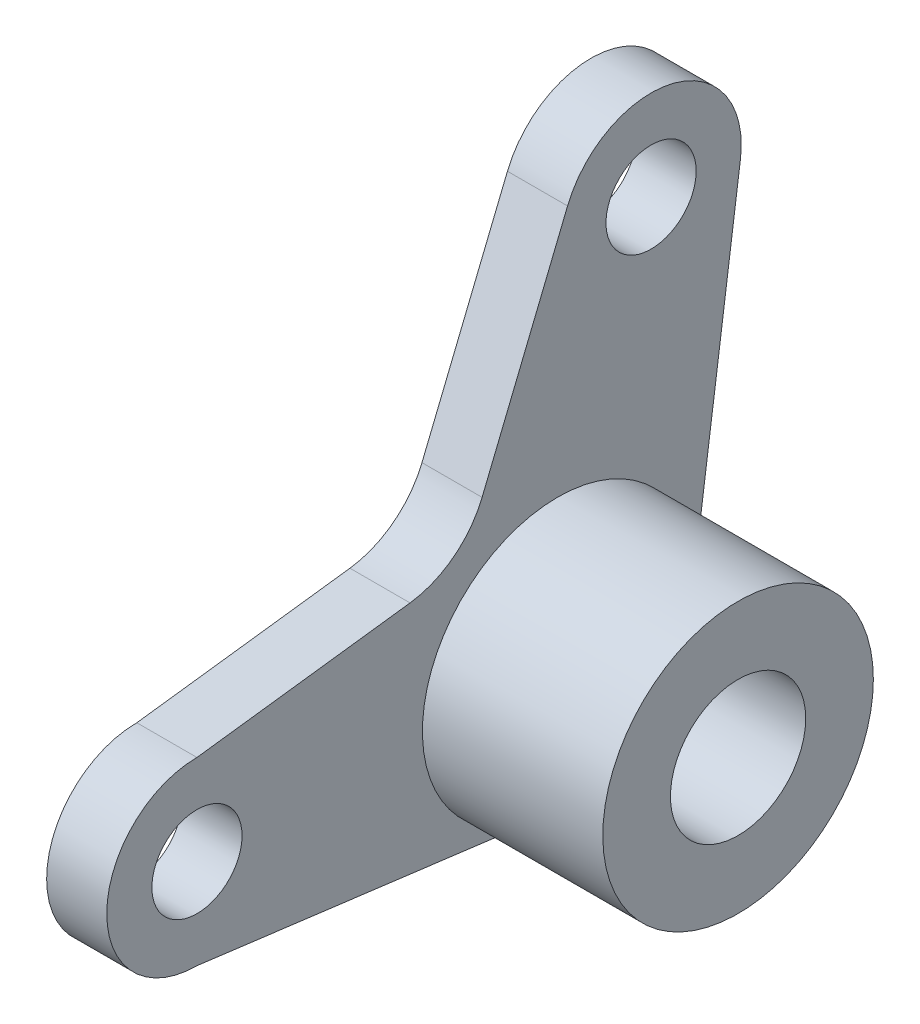
ISO-10303-21;
HEADER;
FILE_DESCRIPTION(('STEP AP214'),'2;1');
FILE_NAME('part.step','',(''),(''),'','','');
FILE_SCHEMA(('AUTOMOTIVE_DESIGN { 1 0 10303 214 1 1 1 1 }'));
ENDSEC;
DATA;
#1=APPLICATION_CONTEXT('core data for automotive mechanical design processes');
#2=APPLICATION_PROTOCOL_DEFINITION('international standard','automotive_design',2000,#1);
#3=PRODUCT_CONTEXT('',#1,'mechanical');
#4=PRODUCT('Part','Part','',(#3));
#5=PRODUCT_RELATED_PRODUCT_CATEGORY('part','',(#4));
#6=PRODUCT_DEFINITION_FORMATION('','',#4);
#7=PRODUCT_DEFINITION_CONTEXT('part definition',#1,'design');
#8=PRODUCT_DEFINITION('design','',#6,#7);
#9=PRODUCT_DEFINITION_SHAPE('','',#8);
#10=(LENGTH_UNIT() NAMED_UNIT(*) SI_UNIT(.MILLI.,.METRE.));
#11=(NAMED_UNIT(*) PLANE_ANGLE_UNIT() SI_UNIT($,.RADIAN.));
#12=(NAMED_UNIT(*) SI_UNIT($,.STERADIAN.) SOLID_ANGLE_UNIT());
#13=UNCERTAINTY_MEASURE_WITH_UNIT(LENGTH_MEASURE(1.E-05),#10,'distance_accuracy_value','');
#14=(GEOMETRIC_REPRESENTATION_CONTEXT(3) GLOBAL_UNCERTAINTY_ASSIGNED_CONTEXT((#13)) GLOBAL_UNIT_ASSIGNED_CONTEXT((#10,
#11,#12)) REPRESENTATION_CONTEXT('',''));
#15=CARTESIAN_POINT('',(0.,0.,0.));
#16=DIRECTION('',(0.,0.,1.));
#17=DIRECTION('',(1.,0.,0.));
#18=AXIS2_PLACEMENT_3D('',#15,#16,#17);
#19=CARTESIAN_POINT('',(20.,16.9888404938314,41.6698847931592));
#20=DIRECTION('',(0.,-0.377529788751808,-0.925997439847981));
#21=DIRECTION('',(0.,0.925997439847981,-0.377529788751808));
#22=AXIS2_PLACEMENT_3D('',#19,#20,#21);
#23=PLANE('',#22);
#24=DIRECTION('',(0.,-0.925997439847981,0.377529788751808));
#25=VECTOR('',#24,1.);
#26=CARTESIAN_POINT('',(0.,16.9888404938314,41.6698847931592));
#27=LINE('',#26,#25);
#28=CARTESIAN_POINT('',(0.,127.236992817243,-3.27836221686229));
#29=VERTEX_POINT('',#28);
#30=CARTESIAN_POINT('',(0.,57.5082556370413,25.1500915614693));
#31=VERTEX_POINT('',#30);
#32=EDGE_CURVE('E150',#29,#31,#27,.T.);
#33=ORIENTED_EDGE('',*,*,#32,.T.);
#34=DIRECTION('',(-1.,0.,0.));
#35=VECTOR('',#34,1.);
#36=CARTESIAN_POINT('',(20.,57.5082556370413,25.1500915614693));
#37=LINE('',#36,#35);
#38=CARTESIAN_POINT('',(20.,57.5082556370413,25.1500915614693));
#39=VERTEX_POINT('',#38);
#40=EDGE_CURVE('E11',#39,#31,#37,.T.);
#41=ORIENTED_EDGE('',*,*,#40,.F.);
#42=DIRECTION('',(0.,-0.925997439847981,0.377529788751808));
#43=VECTOR('',#42,1.);
#44=CARTESIAN_POINT('',(20.,16.9888404938314,41.6698847931592));
#45=LINE('',#44,#43);
#46=CARTESIAN_POINT('',(20.,127.236992817243,-3.27836221686229));
#47=VERTEX_POINT('',#46);
#48=EDGE_CURVE('E195',#47,#39,#45,.T.);
#49=ORIENTED_EDGE('',*,*,#48,.F.);
#50=DIRECTION('',(-1.,0.,0.));
#51=VECTOR('',#50,1.);
#52=CARTESIAN_POINT('',(20.,127.236992817243,-3.27836221686229));
#53=LINE('',#52,#51);
#54=EDGE_CURVE('E142',#47,#29,#53,.T.);
#55=ORIENTED_EDGE('',*,*,#54,.T.);
#56=EDGE_LOOP('',(#33,#41,#49,#55));
#57=FACE_BOUND('',#56,.T.);
#58=ADVANCED_FACE('F39',(#57),#23,.F.);
#59=CARTESIAN_POINT('',(20.,68.8341492995954,52.9300147569088));
#60=DIRECTION('',(-1.,0.,0.));
#61=DIRECTION('',(0.,0.,1.));
#62=AXIS2_PLACEMENT_3D('',#59,#60,#61);
#63=CYLINDRICAL_SURFACE('',#62,30.);
#64=CARTESIAN_POINT('',(0.,68.8341492995954,52.9300147569088));
#65=DIRECTION('',(1.,0.,0.));
#66=DIRECTION('',(0.,0.,-1.));
#67=AXIS2_PLACEMENT_3D('',#64,#65,#66);
#68=CIRCLE('',#67,30.);
#69=CARTESIAN_POINT('',(0.,39.0771643071179,49.1192610050283));
#70=VERTEX_POINT('',#69);
#71=EDGE_CURVE('E153',#31,#70,#68,.F.);
#72=ORIENTED_EDGE('',*,*,#71,.T.);
#73=DIRECTION('',(-1.,0.,0.));
#74=VECTOR('',#73,1.);
#75=CARTESIAN_POINT('',(20.,39.0771643071179,49.1192610050283));
#76=LINE('',#75,#74);
#77=CARTESIAN_POINT('',(20.,39.0771643071179,49.1192610050283));
#78=VERTEX_POINT('',#77);
#79=EDGE_CURVE('E48',#78,#70,#76,.T.);
#80=ORIENTED_EDGE('',*,*,#79,.F.);
#81=CARTESIAN_POINT('',(20.,68.8341492995954,52.9300147569088));
#82=DIRECTION('',(1.,0.,0.));
#83=DIRECTION('',(0.,0.,-1.));
#84=AXIS2_PLACEMENT_3D('',#81,#82,#83);
#85=CIRCLE('',#84,30.);
#86=EDGE_CURVE('E97',#39,#78,#85,.F.);
#87=ORIENTED_EDGE('',*,*,#86,.F.);
#88=ORIENTED_EDGE('',*,*,#40,.T.);
#89=EDGE_LOOP('',(#72,#80,#87,#88));
#90=FACE_BOUND('',#89,.T.);
#91=ADVANCED_FACE('F174',(#90),#63,.F.);
#92=CARTESIAN_POINT('',(20.,44.6354774887161,5.71613062782095));
#93=DIRECTION('',(0.,0.991899499749248,0.127025125062688));
#94=DIRECTION('',(0.,-0.127025125062688,0.991899499749248));
#95=AXIS2_PLACEMENT_3D('',#92,#93,#94);
#96=PLANE('',#95);
#97=DIRECTION('',(0.,0.127025125062688,-0.991899499749248));
#98=VECTOR('',#97,1.);
#99=CARTESIAN_POINT('',(0.,44.6354774887161,5.71613062782095));
#100=LINE('',#99,#98);
#101=CARTESIAN_POINT('',(0.,30.,120.));
#102=VERTEX_POINT('',#101);
#103=EDGE_CURVE('E156',#102,#70,#100,.T.);
#104=ORIENTED_EDGE('',*,*,#103,.F.);
#105=DIRECTION('',(-1.,0.,0.));
#106=VECTOR('',#105,1.);
#107=CARTESIAN_POINT('',(20.,30.,120.));
#108=LINE('',#107,#106);
#109=CARTESIAN_POINT('',(20.,30.,120.));
#110=VERTEX_POINT('',#109);
#111=EDGE_CURVE('E128',#110,#102,#108,.T.);
#112=ORIENTED_EDGE('',*,*,#111,.F.);
#113=DIRECTION('',(0.,0.127025125062688,-0.991899499749248));
#114=VECTOR('',#113,1.);
#115=CARTESIAN_POINT('',(20.,44.6354774887161,5.71613062782095));
#116=LINE('',#115,#114);
#117=EDGE_CURVE('E117',#110,#78,#116,.T.);
#118=ORIENTED_EDGE('',*,*,#117,.T.);
#119=ORIENTED_EDGE('',*,*,#79,.T.);
#120=EDGE_LOOP('',(#104,#112,#118,#119));
#121=FACE_BOUND('',#120,.T.);
#122=ADVANCED_FACE('F173',(#121),#96,.T.);
#123=CARTESIAN_POINT('',(20.,0.,120.));
#124=DIRECTION('',(-1.,0.,0.));
#125=DIRECTION('',(0.,0.,1.));
#126=AXIS2_PLACEMENT_3D('',#123,#124,#125);
#127=CYLINDRICAL_SURFACE('',#126,30.);
#128=CARTESIAN_POINT('',(0.,0.,120.));
#129=DIRECTION('',(1.,0.,0.));
#130=DIRECTION('',(0.,0.,-1.));
#131=AXIS2_PLACEMENT_3D('',#128,#129,#130);
#132=CIRCLE('',#131,30.);
#133=CARTESIAN_POINT('',(0.,-30.,120.));
#134=VERTEX_POINT('',#133);
#135=EDGE_CURVE('E124',#102,#134,#132,.T.);
#136=ORIENTED_EDGE('',*,*,#135,.T.);
#137=DIRECTION('',(-1.,0.,0.));
#138=VECTOR('',#137,1.);
#139=CARTESIAN_POINT('',(20.,-30.,120.));
#140=LINE('',#139,#138);
#141=CARTESIAN_POINT('',(20.,-30.,120.));
#142=VERTEX_POINT('',#141);
#143=EDGE_CURVE('E121',#142,#134,#140,.T.);
#144=ORIENTED_EDGE('',*,*,#143,.F.);
#145=CARTESIAN_POINT('',(20.,0.,120.));
#146=DIRECTION('',(1.,0.,0.));
#147=DIRECTION('',(0.,0.,-1.));
#148=AXIS2_PLACEMENT_3D('',#145,#146,#147);
#149=CIRCLE('',#148,30.);
#150=EDGE_CURVE('E108',#110,#142,#149,.T.);
#151=ORIENTED_EDGE('',*,*,#150,.F.);
#152=ORIENTED_EDGE('',*,*,#111,.T.);
#153=EDGE_LOOP('',(#136,#144,#151,#152));
#154=FACE_BOUND('',#153,.T.);
#155=ADVANCED_FACE('F122',(#154),#127,.T.);
#156=CARTESIAN_POINT('',(20.,-44.6354774887161,5.71613062782095));
#157=DIRECTION('',(0.,0.991899499749248,-0.127025125062688));
#158=DIRECTION('',(0.,0.127025125062688,0.991899499749248));
#159=AXIS2_PLACEMENT_3D('',#156,#157,#158);
#160=PLANE('',#159);
#161=DIRECTION('',(0.,-0.127025125062688,-0.991899499749248));
#162=VECTOR('',#161,1.);
#163=CARTESIAN_POINT('',(0.,-44.6354774887161,5.71613062782095));
#164=LINE('',#163,#162);
#165=CARTESIAN_POINT('',(0.,-44.6354774887161,5.71613062782095));
#166=VERTEX_POINT('',#165);
#167=EDGE_CURVE('E160',#134,#166,#164,.T.);
#168=ORIENTED_EDGE('',*,*,#167,.T.);
#169=DIRECTION('',(-1.,0.,0.));
#170=VECTOR('',#169,1.);
#171=CARTESIAN_POINT('',(20.,-44.6354774887161,5.71613062782095));
#172=LINE('',#171,#170);
#173=CARTESIAN_POINT('',(20.,-44.6354774887162,5.71613062782095));
#174=VERTEX_POINT('',#173);
#175=EDGE_CURVE('E129',#174,#166,#172,.T.);
#176=ORIENTED_EDGE('',*,*,#175,.F.);
#177=DIRECTION('',(0.,-0.127025125062688,-0.991899499749248));
#178=VECTOR('',#177,1.);
#179=CARTESIAN_POINT('',(20.,-44.6354774887161,5.71613062782095));
#180=LINE('',#179,#178);
#181=EDGE_CURVE('E114',#142,#174,#180,.T.);
#182=ORIENTED_EDGE('',*,*,#181,.F.);
#183=ORIENTED_EDGE('',*,*,#143,.T.);
#184=EDGE_LOOP('',(#168,#176,#182,#183));
#185=FACE_BOUND('',#184,.T.);
#186=ADVANCED_FACE('F131',(#185),#160,.F.);
#187=CARTESIAN_POINT('',(20.,-6.12217494807929,-44.5815990505624));
#188=DIRECTION('',(0.,0.13604833217954,0.99070220112361));
#189=DIRECTION('',(0.,-0.99070220112361,0.13604833217954));
#190=AXIS2_PLACEMENT_3D('',#187,#188,#189);
#191=PLANE('',#190);
#192=DIRECTION('',(0.,0.99070220112361,-0.13604833217954));
#193=VECTOR('',#192,1.);
#194=CARTESIAN_POINT('',(0.,-6.12217494807929,-44.5815990505624));
#195=LINE('',#194,#193);
#196=CARTESIAN_POINT('',(0.,-6.12217494807929,-44.5815990505624));
#197=VERTEX_POINT('',#196);
#198=CARTESIAN_POINT('',(0.,111.829649189302,-60.77935144601));
#199=VERTEX_POINT('',#198);
#200=EDGE_CURVE('E83',#197,#199,#195,.T.);
#201=ORIENTED_EDGE('',*,*,#200,.T.);
#202=DIRECTION('',(-1.,0.,0.));
#203=VECTOR('',#202,1.);
#204=CARTESIAN_POINT('',(20.,111.829649189302,-60.77935144601));
#205=LINE('',#204,#203);
#206=CARTESIAN_POINT('',(20.,111.829649189302,-60.77935144601));
#207=VERTEX_POINT('',#206);
#208=EDGE_CURVE('E166',#207,#199,#205,.T.);
#209=ORIENTED_EDGE('',*,*,#208,.F.);
#210=DIRECTION('',(0.,0.99070220112361,-0.13604833217954));
#211=VECTOR('',#210,1.);
#212=CARTESIAN_POINT('',(20.,-6.12217494807929,-44.5815990505624));
#213=LINE('',#212,#211);
#214=CARTESIAN_POINT('',(20.,-6.12217494807929,-44.5815990505624));
#215=VERTEX_POINT('',#214);
#216=EDGE_CURVE('E136',#215,#207,#213,.T.);
#217=ORIENTED_EDGE('',*,*,#216,.F.);
#218=DIRECTION('',(-1.,0.,0.));
#219=VECTOR('',#218,1.);
#220=CARTESIAN_POINT('',(20.,-6.12217494807929,-44.5815990505624));
#221=LINE('',#220,#219);
#222=EDGE_CURVE('E168',#215,#197,#221,.T.);
#223=ORIENTED_EDGE('',*,*,#222,.T.);
#224=EDGE_LOOP('',(#201,#209,#217,#223));
#225=FACE_BOUND('',#224,.T.);
#226=ADVANCED_FACE('F191',(#225),#191,.F.);
#227=CARTESIAN_POINT('',(20.,115.911099154688,-31.0582854123017));
#228=DIRECTION('',(-1.,0.,0.));
#229=DIRECTION('',(0.,0.,1.));
#230=AXIS2_PLACEMENT_3D('',#227,#228,#229);
#231=CYLINDRICAL_SURFACE('',#230,15.);
#232=CARTESIAN_POINT('',(20.,115.911099154688,-31.0582854123017));
#233=DIRECTION('',(1.,0.,0.));
#234=DIRECTION('',(0.,0.,-1.));
#235=AXIS2_PLACEMENT_3D('',#232,#233,#234);
#236=CIRCLE('',#235,15.);
#237=CARTESIAN_POINT('',(20.,115.911099154688,-46.0582854123017));
#238=VERTEX_POINT('',#237);
#239=EDGE_CURVE('E196',#238,#238,#236,.T.);
#240=ORIENTED_EDGE('',*,*,#239,.T.);
#241=EDGE_LOOP('',(#240));
#242=FACE_BOUND('',#241,.T.);
#243=CARTESIAN_POINT('',(0.,115.911099154688,-31.0582854123017));
#244=DIRECTION('',(1.,0.,0.));
#245=DIRECTION('',(0.,0.,-1.));
#246=AXIS2_PLACEMENT_3D('',#243,#244,#245);
#247=CIRCLE('',#246,15.);
#248=CARTESIAN_POINT('',(0.,115.911099154688,-46.0582854123017));
#249=VERTEX_POINT('',#248);
#250=EDGE_CURVE('E146',#249,#249,#247,.T.);
#251=ORIENTED_EDGE('',*,*,#250,.F.);
#252=EDGE_LOOP('',(#251));
#253=FACE_BOUND('',#252,.T.);
#254=ADVANCED_FACE('F232',(#242,#253),#231,.F.);
#255=CARTESIAN_POINT('',(20.,0.,120.));
#256=DIRECTION('',(-1.,0.,0.));
#257=DIRECTION('',(0.,0.,1.));
#258=AXIS2_PLACEMENT_3D('',#255,#256,#257);
#259=CYLINDRICAL_SURFACE('',#258,15.);
#260=CARTESIAN_POINT('',(20.,0.,120.));
#261=DIRECTION('',(1.,0.,0.));
#262=DIRECTION('',(0.,0.,-1.));
#263=AXIS2_PLACEMENT_3D('',#260,#261,#262);
#264=CIRCLE('',#263,15.);
#265=CARTESIAN_POINT('',(20.,0.,105.));
#266=VERTEX_POINT('',#265);
#267=EDGE_CURVE('E164',#266,#266,#264,.T.);
#268=ORIENTED_EDGE('',*,*,#267,.T.);
#269=EDGE_LOOP('',(#268));
#270=FACE_BOUND('',#269,.T.);
#271=CARTESIAN_POINT('',(0.,0.,120.));
#272=DIRECTION('',(1.,0.,0.));
#273=DIRECTION('',(0.,0.,-1.));
#274=AXIS2_PLACEMENT_3D('',#271,#272,#273);
#275=CIRCLE('',#274,15.);
#276=CARTESIAN_POINT('',(0.,0.,105.));
#277=VERTEX_POINT('',#276);
#278=EDGE_CURVE('E143',#277,#277,#275,.T.);
#279=ORIENTED_EDGE('',*,*,#278,.F.);
#280=EDGE_LOOP('',(#279));
#281=FACE_BOUND('',#280,.T.);
#282=ADVANCED_FACE('F41',(#270,#281),#259,.F.);
#283=CARTESIAN_POINT('',(20.,115.911099154688,-31.0582854123017));
#284=DIRECTION('',(-1.,0.,0.));
#285=DIRECTION('',(0.,0.,1.));
#286=AXIS2_PLACEMENT_3D('',#283,#284,#285);
#287=CYLINDRICAL_SURFACE('',#286,30.);
#288=CARTESIAN_POINT('',(0.,115.911099154688,-31.0582854123017));
#289=DIRECTION('',(1.,0.,0.));
#290=DIRECTION('',(0.,0.,-1.));
#291=AXIS2_PLACEMENT_3D('',#288,#289,#290);
#292=CIRCLE('',#291,30.);
#293=EDGE_CURVE('E89',#199,#29,#292,.T.);
#294=ORIENTED_EDGE('',*,*,#293,.T.);
#295=ORIENTED_EDGE('',*,*,#54,.F.);
#296=CARTESIAN_POINT('',(20.,115.911099154688,-31.0582854123017));
#297=DIRECTION('',(1.,0.,0.));
#298=DIRECTION('',(0.,0.,-1.));
#299=AXIS2_PLACEMENT_3D('',#296,#297,#298);
#300=CIRCLE('',#299,30.);
#301=EDGE_CURVE('E56',#207,#47,#300,.T.);
#302=ORIENTED_EDGE('',*,*,#301,.F.);
#303=ORIENTED_EDGE('',*,*,#208,.T.);
#304=EDGE_LOOP('',(#294,#295,#302,#303));
#305=FACE_BOUND('',#304,.T.);
#306=ADVANCED_FACE('F192',(#305),#287,.T.);
#307=CARTESIAN_POINT('',(20.,0.,0.));
#308=DIRECTION('',(1.,0.,0.));
#309=DIRECTION('',(0.,0.,-1.));
#310=AXIS2_PLACEMENT_3D('',#307,#308,#309);
#311=PLANE('',#310);
#312=ORIENTED_EDGE('',*,*,#267,.F.);
#313=EDGE_LOOP('',(#312));
#314=FACE_BOUND('',#313,.T.);
#315=ORIENTED_EDGE('',*,*,#239,.F.);
#316=EDGE_LOOP('',(#315));
#317=FACE_BOUND('',#316,.T.);
#318=ORIENTED_EDGE('',*,*,#48,.T.);
#319=ORIENTED_EDGE('',*,*,#86,.T.);
#320=ORIENTED_EDGE('',*,*,#117,.F.);
#321=ORIENTED_EDGE('',*,*,#150,.T.);
#322=ORIENTED_EDGE('',*,*,#181,.T.);
#323=CARTESIAN_POINT('',(20.,0.,0.));
#324=DIRECTION('',(1.,0.,0.));
#325=DIRECTION('',(0.,0.,-1.));
#326=AXIS2_PLACEMENT_3D('',#323,#324,#325);
#327=CIRCLE('',#326,45.);
#328=EDGE_CURVE('E133',#215,#174,#327,.T.);
#329=ORIENTED_EDGE('',*,*,#328,.F.);
#330=ORIENTED_EDGE('',*,*,#216,.T.);
#331=ORIENTED_EDGE('',*,*,#301,.T.);
#332=EDGE_LOOP('',(#318,#319,#320,#321,#322,#329,#330,#331));
#333=FACE_BOUND('',#332,.T.);
#334=ADVANCED_FACE('F110',(#314,#317,#333),#311,.T.);
#335=CARTESIAN_POINT('',(0.,0.,0.));
#336=DIRECTION('',(1.,0.,0.));
#337=DIRECTION('',(0.,0.,-1.));
#338=AXIS2_PLACEMENT_3D('',#335,#336,#337);
#339=PLANE('',#338);
#340=ORIENTED_EDGE('',*,*,#278,.T.);
#341=EDGE_LOOP('',(#340));
#342=FACE_BOUND('',#341,.T.);
#343=ORIENTED_EDGE('',*,*,#250,.T.);
#344=EDGE_LOOP('',(#343));
#345=FACE_BOUND('',#344,.T.);
#346=ORIENTED_EDGE('',*,*,#32,.F.);
#347=ORIENTED_EDGE('',*,*,#293,.F.);
#348=ORIENTED_EDGE('',*,*,#200,.F.);
#349=CARTESIAN_POINT('',(0.,0.,0.));
#350=DIRECTION('',(1.,0.,0.));
#351=DIRECTION('',(0.,0.,-1.));
#352=AXIS2_PLACEMENT_3D('',#349,#350,#351);
#353=CIRCLE('',#352,45.);
#354=EDGE_CURVE('E181',#166,#197,#353,.T.);
#355=ORIENTED_EDGE('',*,*,#354,.F.);
#356=ORIENTED_EDGE('',*,*,#167,.F.);
#357=ORIENTED_EDGE('',*,*,#135,.F.);
#358=ORIENTED_EDGE('',*,*,#103,.T.);
#359=ORIENTED_EDGE('',*,*,#71,.F.);
#360=EDGE_LOOP('',(#346,#347,#348,#355,#356,#357,#358,#359));
#361=FACE_BOUND('',#360,.T.);
#362=CARTESIAN_POINT('',(0.,0.,0.));
#363=DIRECTION('',(1.,0.,0.));
#364=DIRECTION('',(0.,0.,-1.));
#365=AXIS2_PLACEMENT_3D('',#362,#363,#364);
#366=CIRCLE('',#365,22.5);
#367=CARTESIAN_POINT('',(0.,0.,-22.5));
#368=VERTEX_POINT('',#367);
#369=EDGE_CURVE('E186',#368,#368,#366,.T.);
#370=ORIENTED_EDGE('',*,*,#369,.T.);
#371=EDGE_LOOP('',(#370));
#372=FACE_BOUND('',#371,.T.);
#373=ADVANCED_FACE('F178',(#342,#345,#361,#372),#339,.F.);
#374=CARTESIAN_POINT('',(80.,0.,0.));
#375=DIRECTION('',(-1.,0.,0.));
#376=DIRECTION('',(0.,0.,1.));
#377=AXIS2_PLACEMENT_3D('',#374,#375,#376);
#378=CYLINDRICAL_SURFACE('',#377,22.5);
#379=CARTESIAN_POINT('',(80.,0.,0.));
#380=DIRECTION('',(1.,0.,0.));
#381=DIRECTION('',(0.,0.,-1.));
#382=AXIS2_PLACEMENT_3D('',#379,#380,#381);
#383=CIRCLE('',#382,22.5);
#384=CARTESIAN_POINT('',(80.,0.,-22.5));
#385=VERTEX_POINT('',#384);
#386=EDGE_CURVE('E185',#385,#385,#383,.T.);
#387=ORIENTED_EDGE('',*,*,#386,.T.);
#388=EDGE_LOOP('',(#387));
#389=FACE_BOUND('',#388,.T.);
#390=ORIENTED_EDGE('',*,*,#369,.F.);
#391=EDGE_LOOP('',(#390));
#392=FACE_BOUND('',#391,.T.);
#393=ADVANCED_FACE('F211',(#389,#392),#378,.F.);
#394=CARTESIAN_POINT('',(80.,0.,0.));
#395=DIRECTION('',(-1.,0.,0.));
#396=DIRECTION('',(0.,0.,1.));
#397=AXIS2_PLACEMENT_3D('',#394,#395,#396);
#398=CYLINDRICAL_SURFACE('',#397,45.);
#399=ORIENTED_EDGE('',*,*,#175,.T.);
#400=ORIENTED_EDGE('',*,*,#354,.T.);
#401=ORIENTED_EDGE('',*,*,#222,.F.);
#402=ORIENTED_EDGE('',*,*,#328,.T.);
#403=EDGE_LOOP('',(#399,#400,#401,#402));
#404=FACE_BOUND('',#403,.T.);
#405=CARTESIAN_POINT('',(80.,0.,0.));
#406=DIRECTION('',(1.,0.,0.));
#407=DIRECTION('',(0.,0.,-1.));
#408=AXIS2_PLACEMENT_3D('',#405,#406,#407);
#409=CIRCLE('',#408,45.);
#410=CARTESIAN_POINT('',(80.,0.,-45.));
#411=VERTEX_POINT('',#410);
#412=EDGE_CURVE('E147',#411,#411,#409,.T.);
#413=ORIENTED_EDGE('',*,*,#412,.F.);
#414=EDGE_LOOP('',(#413));
#415=FACE_BOUND('',#414,.T.);
#416=ADVANCED_FACE('F188',(#404,#415),#398,.T.);
#417=CARTESIAN_POINT('',(80.,0.,0.));
#418=DIRECTION('',(1.,0.,0.));
#419=DIRECTION('',(0.,0.,-1.));
#420=AXIS2_PLACEMENT_3D('',#417,#418,#419);
#421=PLANE('',#420);
#422=ORIENTED_EDGE('',*,*,#386,.F.);
#423=EDGE_LOOP('',(#422));
#424=FACE_BOUND('',#423,.T.);
#425=ORIENTED_EDGE('',*,*,#412,.T.);
#426=EDGE_LOOP('',(#425));
#427=FACE_BOUND('',#426,.T.);
#428=ADVANCED_FACE('F214',(#424,#427),#421,.T.);
#429=CLOSED_SHELL('',(#58,#91,#122,#155,#186,#226,#254,#282,#306,#334,#373,#393,#416,#428));
#430=MANIFOLD_SOLID_BREP('B2',#429);
#431=ADVANCED_BREP_SHAPE_REPRESENTATION('',(#18,#430),#14);
#432=SHAPE_DEFINITION_REPRESENTATION(#9,#431);
ENDSEC;
END-ISO-10303-21;
